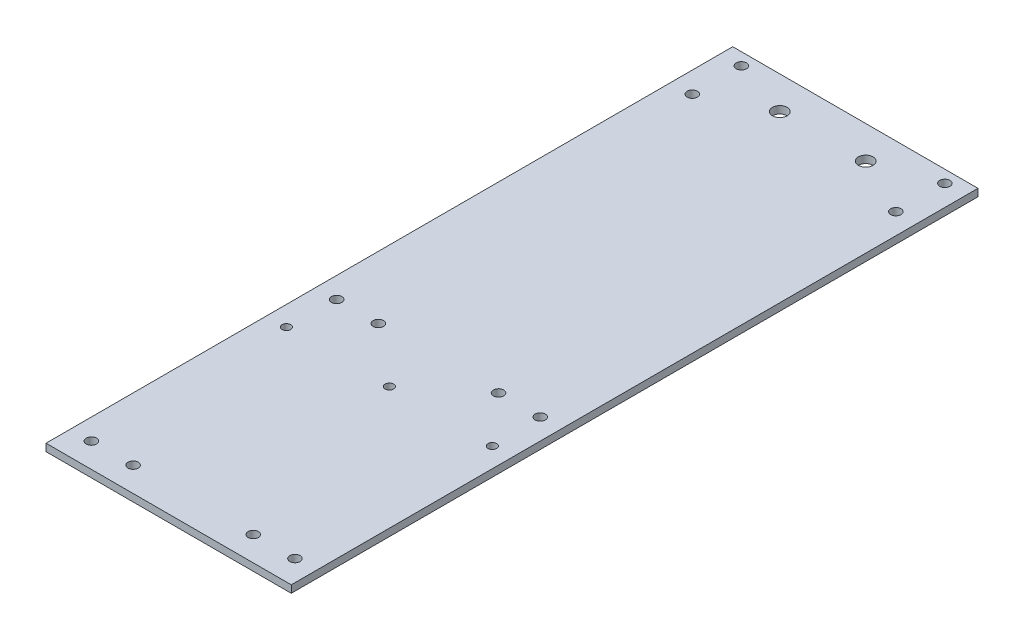
ISO-10303-21;
HEADER;
FILE_DESCRIPTION(('STEP AP214'),'2;1');
FILE_NAME('part.step','',(''),(''),'','','');
FILE_SCHEMA(('AUTOMOTIVE_DESIGN { 1 0 10303 214 1 1 1 1 }'));
ENDSEC;
DATA;
#1=APPLICATION_CONTEXT('core data for automotive mechanical design processes');
#2=APPLICATION_PROTOCOL_DEFINITION('international standard','automotive_design',2000,#1);
#3=PRODUCT_CONTEXT('',#1,'mechanical');
#4=PRODUCT('Part','Part','',(#3));
#5=PRODUCT_RELATED_PRODUCT_CATEGORY('part','',(#4));
#6=PRODUCT_DEFINITION_FORMATION('','',#4);
#7=PRODUCT_DEFINITION_CONTEXT('part definition',#1,'design');
#8=PRODUCT_DEFINITION('design','',#6,#7);
#9=PRODUCT_DEFINITION_SHAPE('','',#8);
#10=(LENGTH_UNIT() NAMED_UNIT(*) SI_UNIT(.MILLI.,.METRE.));
#11=(NAMED_UNIT(*) PLANE_ANGLE_UNIT() SI_UNIT($,.RADIAN.));
#12=(NAMED_UNIT(*) SI_UNIT($,.STERADIAN.) SOLID_ANGLE_UNIT());
#13=UNCERTAINTY_MEASURE_WITH_UNIT(LENGTH_MEASURE(1.E-05),#10,'distance_accuracy_value','');
#14=(GEOMETRIC_REPRESENTATION_CONTEXT(3) GLOBAL_UNCERTAINTY_ASSIGNED_CONTEXT((#13)) GLOBAL_UNIT_ASSIGNED_CONTEXT((#10,
#11,#12)) REPRESENTATION_CONTEXT('',''));
#15=CARTESIAN_POINT('',(0.,0.,0.));
#16=DIRECTION('',(0.,0.,1.));
#17=DIRECTION('',(1.,0.,0.));
#18=AXIS2_PLACEMENT_3D('',#15,#16,#17);
#19=CARTESIAN_POINT('',(0.,3.,0.));
#20=DIRECTION('',(0.,1.,0.));
#21=DIRECTION('',(0.,0.,1.));
#22=AXIS2_PLACEMENT_3D('',#19,#20,#21);
#23=PLANE('',#22);
#24=CARTESIAN_POINT('',(41.4999999999999,3.,-215.));
#25=DIRECTION('',(0.,1.,0.));
#26=DIRECTION('',(0.,0.,1.));
#27=AXIS2_PLACEMENT_3D('',#24,#25,#26);
#28=CIRCLE('',#27,2.09999999999999);
#29=CARTESIAN_POINT('',(41.4999999999999,3.,-212.9));
#30=VERTEX_POINT('',#29);
#31=EDGE_CURVE('E282',#30,#30,#28,.T.);
#32=ORIENTED_EDGE('',*,*,#31,.F.);
#33=EDGE_LOOP('',(#32));
#34=FACE_BOUND('',#33,.T.);
#35=CARTESIAN_POINT('',(41.4999999999999,3.,-195.));
#36=DIRECTION('',(0.,1.,0.));
#37=DIRECTION('',(0.,0.,1.));
#38=AXIS2_PLACEMENT_3D('',#35,#36,#37);
#39=CIRCLE('',#38,2.09999999999999);
#40=CARTESIAN_POINT('',(41.4999999999999,3.,-192.9));
#41=VERTEX_POINT('',#40);
#42=EDGE_CURVE('E292',#41,#41,#39,.T.);
#43=ORIENTED_EDGE('',*,*,#42,.F.);
#44=EDGE_LOOP('',(#43));
#45=FACE_BOUND('',#44,.T.);
#46=CARTESIAN_POINT('',(-41.5000000000001,3.,-195.));
#47=DIRECTION('',(0.,1.,0.));
#48=DIRECTION('',(0.,0.,1.));
#49=AXIS2_PLACEMENT_3D('',#46,#47,#48);
#50=CIRCLE('',#49,2.09999999999999);
#51=CARTESIAN_POINT('',(-41.5000000000001,3.,-192.9));
#52=VERTEX_POINT('',#51);
#53=EDGE_CURVE('E298',#52,#52,#50,.T.);
#54=ORIENTED_EDGE('',*,*,#53,.F.);
#55=EDGE_LOOP('',(#54));
#56=FACE_BOUND('',#55,.T.);
#57=CARTESIAN_POINT('',(-41.5000000000001,3.,-215.));
#58=DIRECTION('',(0.,1.,0.));
#59=DIRECTION('',(0.,0.,1.));
#60=AXIS2_PLACEMENT_3D('',#57,#58,#59);
#61=CIRCLE('',#60,2.09999999999999);
#62=CARTESIAN_POINT('',(-41.5000000000001,3.,-212.9));
#63=VERTEX_POINT('',#62);
#64=EDGE_CURVE('E304',#63,#63,#61,.T.);
#65=ORIENTED_EDGE('',*,*,#64,.F.);
#66=EDGE_LOOP('',(#65));
#67=FACE_BOUND('',#66,.T.);
#68=CARTESIAN_POINT('',(-17.5,3.,-206.7));
#69=DIRECTION('',(0.,1.,0.));
#70=DIRECTION('',(0.,0.,1.));
#71=AXIS2_PLACEMENT_3D('',#68,#69,#70);
#72=CIRCLE('',#71,3.);
#73=CARTESIAN_POINT('',(-17.5,3.,-203.7));
#74=VERTEX_POINT('',#73);
#75=EDGE_CURVE('E310',#74,#74,#72,.T.);
#76=ORIENTED_EDGE('',*,*,#75,.F.);
#77=EDGE_LOOP('',(#76));
#78=FACE_BOUND('',#77,.T.);
#79=CARTESIAN_POINT('',(17.5,3.,-206.7));
#80=DIRECTION('',(0.,1.,0.));
#81=DIRECTION('',(0.,0.,1.));
#82=AXIS2_PLACEMENT_3D('',#79,#80,#81);
#83=CIRCLE('',#82,3.);
#84=CARTESIAN_POINT('',(17.5,3.,-203.7));
#85=VERTEX_POINT('',#84);
#86=EDGE_CURVE('E105',#85,#85,#83,.T.);
#87=ORIENTED_EDGE('',*,*,#86,.F.);
#88=EDGE_LOOP('',(#87));
#89=FACE_BOUND('',#88,.T.);
#90=CARTESIAN_POINT('',(-24.5,3.,50.));
#91=DIRECTION('',(0.,1.,0.));
#92=DIRECTION('',(0.,0.,1.));
#93=AXIS2_PLACEMENT_3D('',#90,#91,#92);
#94=CIRCLE('',#93,2.1);
#95=CARTESIAN_POINT('',(-24.5,3.,52.1));
#96=VERTEX_POINT('',#95);
#97=EDGE_CURVE('E117',#96,#96,#94,.T.);
#98=ORIENTED_EDGE('',*,*,#97,.F.);
#99=EDGE_LOOP('',(#98));
#100=FACE_BOUND('',#99,.T.);
#101=CARTESIAN_POINT('',(24.5,3.,50.));
#102=DIRECTION('',(0.,1.,0.));
#103=DIRECTION('',(0.,0.,1.));
#104=AXIS2_PLACEMENT_3D('',#101,#102,#103);
#105=CIRCLE('',#104,2.1);
#106=CARTESIAN_POINT('',(24.5,3.,52.1));
#107=VERTEX_POINT('',#106);
#108=EDGE_CURVE('E123',#107,#107,#105,.T.);
#109=ORIENTED_EDGE('',*,*,#108,.F.);
#110=EDGE_LOOP('',(#109));
#111=FACE_BOUND('',#110,.T.);
#112=CARTESIAN_POINT('',(24.5,3.,-50.));
#113=DIRECTION('',(0.,1.,0.));
#114=DIRECTION('',(0.,0.,1.));
#115=AXIS2_PLACEMENT_3D('',#112,#113,#114);
#116=CIRCLE('',#115,2.1);
#117=CARTESIAN_POINT('',(24.5,3.,-47.9));
#118=VERTEX_POINT('',#117);
#119=EDGE_CURVE('E129',#118,#118,#116,.T.);
#120=ORIENTED_EDGE('',*,*,#119,.F.);
#121=EDGE_LOOP('',(#120));
#122=FACE_BOUND('',#121,.T.);
#123=CARTESIAN_POINT('',(-24.5,3.,-50.));
#124=DIRECTION('',(0.,1.,0.));
#125=DIRECTION('',(0.,0.,1.));
#126=AXIS2_PLACEMENT_3D('',#123,#124,#125);
#127=CIRCLE('',#126,2.1);
#128=CARTESIAN_POINT('',(-24.5,3.,-47.9));
#129=VERTEX_POINT('',#128);
#130=EDGE_CURVE('E135',#129,#129,#127,.T.);
#131=ORIENTED_EDGE('',*,*,#130,.F.);
#132=EDGE_LOOP('',(#131));
#133=FACE_BOUND('',#132,.T.);
#134=CARTESIAN_POINT('',(0.,3.,-30.));
#135=DIRECTION('',(0.,1.,0.));
#136=DIRECTION('',(0.,0.,1.));
#137=AXIS2_PLACEMENT_3D('',#134,#135,#136);
#138=CIRCLE('',#137,1.75);
#139=CARTESIAN_POINT('',(0.,3.,-28.25));
#140=VERTEX_POINT('',#139);
#141=EDGE_CURVE('E145',#140,#140,#138,.T.);
#142=ORIENTED_EDGE('',*,*,#141,.F.);
#143=EDGE_LOOP('',(#142));
#144=FACE_BOUND('',#143,.T.);
#145=CARTESIAN_POINT('',(-41.5,3.,-50.));
#146=DIRECTION('',(0.,1.,0.));
#147=DIRECTION('',(0.,0.,-1.));
#148=AXIS2_PLACEMENT_3D('',#145,#146,#147);
#149=CIRCLE('',#148,2.1);
#150=CARTESIAN_POINT('',(-41.5,3.,-52.1));
#151=VERTEX_POINT('',#150);
#152=EDGE_CURVE('E157',#151,#151,#149,.T.);
#153=ORIENTED_EDGE('',*,*,#152,.F.);
#154=EDGE_LOOP('',(#153));
#155=FACE_BOUND('',#154,.T.);
#156=CARTESIAN_POINT('',(41.5,3.,50.));
#157=DIRECTION('',(0.,1.,0.));
#158=DIRECTION('',(0.,0.,-1.));
#159=AXIS2_PLACEMENT_3D('',#156,#157,#158);
#160=CIRCLE('',#159,2.09999999999999);
#161=CARTESIAN_POINT('',(41.5,3.,47.9));
#162=VERTEX_POINT('',#161);
#163=EDGE_CURVE('E169',#162,#162,#160,.T.);
#164=ORIENTED_EDGE('',*,*,#163,.F.);
#165=EDGE_LOOP('',(#164));
#166=FACE_BOUND('',#165,.T.);
#167=DIRECTION('',(0.,0.,-1.));
#168=VECTOR('',#167,1.);
#169=CARTESIAN_POINT('',(50.,3.,-60.));
#170=LINE('',#169,#168);
#171=CARTESIAN_POINT('',(50.,3.,60.));
#172=VERTEX_POINT('',#171);
#173=CARTESIAN_POINT('',(50.,3.,-220.));
#174=VERTEX_POINT('',#173);
#175=EDGE_CURVE('E92',#172,#174,#170,.T.);
#176=ORIENTED_EDGE('',*,*,#175,.T.);
#177=DIRECTION('',(1.,0.,0.));
#178=VECTOR('',#177,1.);
#179=CARTESIAN_POINT('',(-50.,3.,-220.));
#180=LINE('',#179,#178);
#181=CARTESIAN_POINT('',(-50.,3.,-220.));
#182=VERTEX_POINT('',#181);
#183=EDGE_CURVE('E95',#182,#174,#180,.T.);
#184=ORIENTED_EDGE('',*,*,#183,.F.);
#185=DIRECTION('',(0.,0.,1.));
#186=VECTOR('',#185,1.);
#187=CARTESIAN_POINT('',(-50.,3.,-60.));
#188=LINE('',#187,#186);
#189=CARTESIAN_POINT('',(-50.,3.,60.));
#190=VERTEX_POINT('',#189);
#191=EDGE_CURVE('E87',#182,#190,#188,.T.);
#192=ORIENTED_EDGE('',*,*,#191,.T.);
#193=DIRECTION('',(1.,0.,0.));
#194=VECTOR('',#193,1.);
#195=CARTESIAN_POINT('',(-50.,3.,60.));
#196=LINE('',#195,#194);
#197=EDGE_CURVE('E62',#190,#172,#196,.T.);
#198=ORIENTED_EDGE('',*,*,#197,.T.);
#199=EDGE_LOOP('',(#176,#184,#192,#198));
#200=FACE_BOUND('',#199,.T.);
#201=CARTESIAN_POINT('',(41.5,3.,-50.));
#202=DIRECTION('',(0.,1.,0.));
#203=DIRECTION('',(0.,0.,1.));
#204=AXIS2_PLACEMENT_3D('',#201,#202,#203);
#205=CIRCLE('',#204,2.1);
#206=CARTESIAN_POINT('',(41.5,3.,-47.9));
#207=VERTEX_POINT('',#206);
#208=EDGE_CURVE('E175',#207,#207,#205,.T.);
#209=ORIENTED_EDGE('',*,*,#208,.F.);
#210=EDGE_LOOP('',(#209));
#211=FACE_BOUND('',#210,.T.);
#212=CARTESIAN_POINT('',(-41.5,3.,50.));
#213=DIRECTION('',(0.,1.,0.));
#214=DIRECTION('',(0.,0.,1.));
#215=AXIS2_PLACEMENT_3D('',#212,#213,#214);
#216=CIRCLE('',#215,2.09999999999999);
#217=CARTESIAN_POINT('',(-41.5,3.,52.1));
#218=VERTEX_POINT('',#217);
#219=EDGE_CURVE('E163',#218,#218,#216,.T.);
#220=ORIENTED_EDGE('',*,*,#219,.F.);
#221=EDGE_LOOP('',(#220));
#222=FACE_BOUND('',#221,.T.);
#223=CARTESIAN_POINT('',(-42.,3.,-30.));
#224=DIRECTION('',(0.,1.,0.));
#225=DIRECTION('',(0.,0.,1.));
#226=AXIS2_PLACEMENT_3D('',#223,#224,#225);
#227=CIRCLE('',#226,1.75);
#228=CARTESIAN_POINT('',(-42.,3.,-28.25));
#229=VERTEX_POINT('',#228);
#230=EDGE_CURVE('E151',#229,#229,#227,.T.);
#231=ORIENTED_EDGE('',*,*,#230,.F.);
#232=EDGE_LOOP('',(#231));
#233=FACE_BOUND('',#232,.T.);
#234=CARTESIAN_POINT('',(42.,3.,-30.));
#235=DIRECTION('',(0.,1.,0.));
#236=DIRECTION('',(0.,0.,1.));
#237=AXIS2_PLACEMENT_3D('',#234,#235,#236);
#238=CIRCLE('',#237,1.75);
#239=CARTESIAN_POINT('',(42.,3.,-28.25));
#240=VERTEX_POINT('',#239);
#241=EDGE_CURVE('E139',#240,#240,#238,.T.);
#242=ORIENTED_EDGE('',*,*,#241,.F.);
#243=EDGE_LOOP('',(#242));
#244=FACE_BOUND('',#243,.T.);
#245=ADVANCED_FACE('F45',(#34,#45,#56,#67,#78,#89,#100,#111,#122,#133,#144,#155,#166,#200,#211,
#222,#233,#244),#23,.T.);
#246=CARTESIAN_POINT('',(0.,0.,0.));
#247=DIRECTION('',(0.,1.,0.));
#248=DIRECTION('',(0.,0.,1.));
#249=AXIS2_PLACEMENT_3D('',#246,#247,#248);
#250=PLANE('',#249);
#251=CARTESIAN_POINT('',(41.4999999999999,0.,-215.));
#252=DIRECTION('',(0.,-1.,0.));
#253=DIRECTION('',(0.,0.,-1.));
#254=AXIS2_PLACEMENT_3D('',#251,#252,#253);
#255=CIRCLE('',#254,2.09999999999999);
#256=CARTESIAN_POINT('',(41.4999999999999,0.,-217.1));
#257=VERTEX_POINT('',#256);
#258=EDGE_CURVE('E285',#257,#257,#255,.T.);
#259=ORIENTED_EDGE('',*,*,#258,.F.);
#260=EDGE_LOOP('',(#259));
#261=FACE_BOUND('',#260,.T.);
#262=CARTESIAN_POINT('',(41.4999999999999,0.,-195.));
#263=DIRECTION('',(0.,-1.,0.));
#264=DIRECTION('',(0.,0.,-1.));
#265=AXIS2_PLACEMENT_3D('',#262,#263,#264);
#266=CIRCLE('',#265,2.09999999999999);
#267=CARTESIAN_POINT('',(41.4999999999999,0.,-197.1));
#268=VERTEX_POINT('',#267);
#269=EDGE_CURVE('E287',#268,#268,#266,.T.);
#270=ORIENTED_EDGE('',*,*,#269,.F.);
#271=EDGE_LOOP('',(#270));
#272=FACE_BOUND('',#271,.T.);
#273=CARTESIAN_POINT('',(-41.5000000000001,0.,-195.));
#274=DIRECTION('',(0.,-1.,0.));
#275=DIRECTION('',(0.,0.,-1.));
#276=AXIS2_PLACEMENT_3D('',#273,#274,#275);
#277=CIRCLE('',#276,2.09999999999999);
#278=CARTESIAN_POINT('',(-41.5000000000001,0.,-197.1));
#279=VERTEX_POINT('',#278);
#280=EDGE_CURVE('E295',#279,#279,#277,.T.);
#281=ORIENTED_EDGE('',*,*,#280,.F.);
#282=EDGE_LOOP('',(#281));
#283=FACE_BOUND('',#282,.T.);
#284=CARTESIAN_POINT('',(-41.5000000000001,0.,-215.));
#285=DIRECTION('',(0.,-1.,0.));
#286=DIRECTION('',(0.,0.,-1.));
#287=AXIS2_PLACEMENT_3D('',#284,#285,#286);
#288=CIRCLE('',#287,2.09999999999999);
#289=CARTESIAN_POINT('',(-41.5000000000001,0.,-217.1));
#290=VERTEX_POINT('',#289);
#291=EDGE_CURVE('E301',#290,#290,#288,.T.);
#292=ORIENTED_EDGE('',*,*,#291,.F.);
#293=EDGE_LOOP('',(#292));
#294=FACE_BOUND('',#293,.T.);
#295=CARTESIAN_POINT('',(-17.5,0.,-206.7));
#296=DIRECTION('',(0.,-1.,0.));
#297=DIRECTION('',(0.,0.,-1.));
#298=AXIS2_PLACEMENT_3D('',#295,#296,#297);
#299=CIRCLE('',#298,3.);
#300=CARTESIAN_POINT('',(-17.5,0.,-209.7));
#301=VERTEX_POINT('',#300);
#302=EDGE_CURVE('E307',#301,#301,#299,.T.);
#303=ORIENTED_EDGE('',*,*,#302,.F.);
#304=EDGE_LOOP('',(#303));
#305=FACE_BOUND('',#304,.T.);
#306=CARTESIAN_POINT('',(17.5,0.,-206.7));
#307=DIRECTION('',(0.,-1.,0.));
#308=DIRECTION('',(0.,0.,-1.));
#309=AXIS2_PLACEMENT_3D('',#306,#307,#308);
#310=CIRCLE('',#309,3.);
#311=CARTESIAN_POINT('',(17.5,0.,-209.7));
#312=VERTEX_POINT('',#311);
#313=EDGE_CURVE('E108',#312,#312,#310,.T.);
#314=ORIENTED_EDGE('',*,*,#313,.F.);
#315=EDGE_LOOP('',(#314));
#316=FACE_BOUND('',#315,.T.);
#317=CARTESIAN_POINT('',(-24.5,0.,50.));
#318=DIRECTION('',(0.,-1.,0.));
#319=DIRECTION('',(0.,0.,-1.));
#320=AXIS2_PLACEMENT_3D('',#317,#318,#319);
#321=CIRCLE('',#320,2.1);
#322=CARTESIAN_POINT('',(-24.5,0.,47.9));
#323=VERTEX_POINT('',#322);
#324=EDGE_CURVE('E114',#323,#323,#321,.T.);
#325=ORIENTED_EDGE('',*,*,#324,.F.);
#326=EDGE_LOOP('',(#325));
#327=FACE_BOUND('',#326,.T.);
#328=CARTESIAN_POINT('',(24.5,0.,50.));
#329=DIRECTION('',(0.,-1.,0.));
#330=DIRECTION('',(0.,0.,-1.));
#331=AXIS2_PLACEMENT_3D('',#328,#329,#330);
#332=CIRCLE('',#331,2.1);
#333=CARTESIAN_POINT('',(24.5,0.,47.9));
#334=VERTEX_POINT('',#333);
#335=EDGE_CURVE('E120',#334,#334,#332,.T.);
#336=ORIENTED_EDGE('',*,*,#335,.F.);
#337=EDGE_LOOP('',(#336));
#338=FACE_BOUND('',#337,.T.);
#339=CARTESIAN_POINT('',(24.5,0.,-50.));
#340=DIRECTION('',(0.,-1.,0.));
#341=DIRECTION('',(0.,0.,-1.));
#342=AXIS2_PLACEMENT_3D('',#339,#340,#341);
#343=CIRCLE('',#342,2.1);
#344=CARTESIAN_POINT('',(24.5,0.,-52.1));
#345=VERTEX_POINT('',#344);
#346=EDGE_CURVE('E126',#345,#345,#343,.T.);
#347=ORIENTED_EDGE('',*,*,#346,.F.);
#348=EDGE_LOOP('',(#347));
#349=FACE_BOUND('',#348,.T.);
#350=CARTESIAN_POINT('',(-24.5,0.,-50.));
#351=DIRECTION('',(0.,-1.,0.));
#352=DIRECTION('',(0.,0.,-1.));
#353=AXIS2_PLACEMENT_3D('',#350,#351,#352);
#354=CIRCLE('',#353,2.1);
#355=CARTESIAN_POINT('',(-24.5,0.,-52.1));
#356=VERTEX_POINT('',#355);
#357=EDGE_CURVE('E132',#356,#356,#354,.T.);
#358=ORIENTED_EDGE('',*,*,#357,.F.);
#359=EDGE_LOOP('',(#358));
#360=FACE_BOUND('',#359,.T.);
#361=DIRECTION('',(0.,0.,-1.));
#362=VECTOR('',#361,1.);
#363=CARTESIAN_POINT('',(50.,0.,-60.));
#364=LINE('',#363,#362);
#365=CARTESIAN_POINT('',(50.,0.,60.));
#366=VERTEX_POINT('',#365);
#367=CARTESIAN_POINT('',(50.,0.,-220.));
#368=VERTEX_POINT('',#367);
#369=EDGE_CURVE('E178',#366,#368,#364,.T.);
#370=ORIENTED_EDGE('',*,*,#369,.F.);
#371=DIRECTION('',(1.,0.,0.));
#372=VECTOR('',#371,1.);
#373=CARTESIAN_POINT('',(-50.,0.,60.));
#374=LINE('',#373,#372);
#375=CARTESIAN_POINT('',(-50.,0.,60.));
#376=VERTEX_POINT('',#375);
#377=EDGE_CURVE('E181',#376,#366,#374,.T.);
#378=ORIENTED_EDGE('',*,*,#377,.F.);
#379=DIRECTION('',(0.,0.,1.));
#380=VECTOR('',#379,1.);
#381=CARTESIAN_POINT('',(-50.,0.,-60.));
#382=LINE('',#381,#380);
#383=CARTESIAN_POINT('',(-50.,0.,-220.));
#384=VERTEX_POINT('',#383);
#385=EDGE_CURVE('E73',#384,#376,#382,.T.);
#386=ORIENTED_EDGE('',*,*,#385,.F.);
#387=DIRECTION('',(-1.,0.,0.));
#388=VECTOR('',#387,1.);
#389=CARTESIAN_POINT('',(-50.,0.,-220.));
#390=LINE('',#389,#388);
#391=EDGE_CURVE('E104',#368,#384,#390,.T.);
#392=ORIENTED_EDGE('',*,*,#391,.F.);
#393=EDGE_LOOP('',(#370,#378,#386,#392));
#394=FACE_BOUND('',#393,.T.);
#395=CARTESIAN_POINT('',(41.5,0.,-50.));
#396=DIRECTION('',(0.,1.,0.));
#397=DIRECTION('',(0.,0.,1.));
#398=AXIS2_PLACEMENT_3D('',#395,#396,#397);
#399=CIRCLE('',#398,2.1);
#400=CARTESIAN_POINT('',(41.5,0.,-47.9));
#401=VERTEX_POINT('',#400);
#402=EDGE_CURVE('E172',#401,#401,#399,.T.);
#403=ORIENTED_EDGE('',*,*,#402,.T.);
#404=EDGE_LOOP('',(#403));
#405=FACE_BOUND('',#404,.T.);
#406=CARTESIAN_POINT('',(41.5,0.,50.));
#407=DIRECTION('',(0.,1.,0.));
#408=DIRECTION('',(0.,0.,-1.));
#409=AXIS2_PLACEMENT_3D('',#406,#407,#408);
#410=CIRCLE('',#409,2.09999999999999);
#411=CARTESIAN_POINT('',(41.5,0.,47.9));
#412=VERTEX_POINT('',#411);
#413=EDGE_CURVE('E166',#412,#412,#410,.T.);
#414=ORIENTED_EDGE('',*,*,#413,.T.);
#415=EDGE_LOOP('',(#414));
#416=FACE_BOUND('',#415,.T.);
#417=CARTESIAN_POINT('',(-41.5,0.,50.));
#418=DIRECTION('',(0.,1.,0.));
#419=DIRECTION('',(0.,0.,1.));
#420=AXIS2_PLACEMENT_3D('',#417,#418,#419);
#421=CIRCLE('',#420,2.09999999999999);
#422=CARTESIAN_POINT('',(-41.5,0.,52.1));
#423=VERTEX_POINT('',#422);
#424=EDGE_CURVE('E160',#423,#423,#421,.T.);
#425=ORIENTED_EDGE('',*,*,#424,.T.);
#426=EDGE_LOOP('',(#425));
#427=FACE_BOUND('',#426,.T.);
#428=CARTESIAN_POINT('',(-41.5,0.,-50.));
#429=DIRECTION('',(0.,1.,0.));
#430=DIRECTION('',(0.,0.,-1.));
#431=AXIS2_PLACEMENT_3D('',#428,#429,#430);
#432=CIRCLE('',#431,2.1);
#433=CARTESIAN_POINT('',(-41.5,0.,-52.1));
#434=VERTEX_POINT('',#433);
#435=EDGE_CURVE('E154',#434,#434,#432,.T.);
#436=ORIENTED_EDGE('',*,*,#435,.T.);
#437=EDGE_LOOP('',(#436));
#438=FACE_BOUND('',#437,.T.);
#439=CARTESIAN_POINT('',(-42.,0.,-30.));
#440=DIRECTION('',(0.,1.,0.));
#441=DIRECTION('',(0.,0.,1.));
#442=AXIS2_PLACEMENT_3D('',#439,#440,#441);
#443=CIRCLE('',#442,1.75);
#444=CARTESIAN_POINT('',(-42.,0.,-28.25));
#445=VERTEX_POINT('',#444);
#446=EDGE_CURVE('E148',#445,#445,#443,.T.);
#447=ORIENTED_EDGE('',*,*,#446,.T.);
#448=EDGE_LOOP('',(#447));
#449=FACE_BOUND('',#448,.T.);
#450=CARTESIAN_POINT('',(0.,0.,-30.));
#451=DIRECTION('',(0.,1.,0.));
#452=DIRECTION('',(0.,0.,1.));
#453=AXIS2_PLACEMENT_3D('',#450,#451,#452);
#454=CIRCLE('',#453,1.75);
#455=CARTESIAN_POINT('',(0.,0.,-28.25));
#456=VERTEX_POINT('',#455);
#457=EDGE_CURVE('E142',#456,#456,#454,.T.);
#458=ORIENTED_EDGE('',*,*,#457,.T.);
#459=EDGE_LOOP('',(#458));
#460=FACE_BOUND('',#459,.T.);
#461=CARTESIAN_POINT('',(42.,0.,-30.));
#462=DIRECTION('',(0.,1.,0.));
#463=DIRECTION('',(0.,0.,1.));
#464=AXIS2_PLACEMENT_3D('',#461,#462,#463);
#465=CIRCLE('',#464,1.75);
#466=CARTESIAN_POINT('',(42.,0.,-28.25));
#467=VERTEX_POINT('',#466);
#468=EDGE_CURVE('E138',#467,#467,#465,.T.);
#469=ORIENTED_EDGE('',*,*,#468,.T.);
#470=EDGE_LOOP('',(#469));
#471=FACE_BOUND('',#470,.T.);
#472=ADVANCED_FACE('F190',(#261,#272,#283,#294,#305,#316,#327,#338,#349,#360,#394,#405,#416,
#427,#438,#449,#460,#471),#250,.F.);
#473=CARTESIAN_POINT('',(50.,3.,-60.));
#474=DIRECTION('',(-1.,0.,0.));
#475=DIRECTION('',(0.,0.,1.));
#476=AXIS2_PLACEMENT_3D('',#473,#474,#475);
#477=PLANE('',#476);
#478=ORIENTED_EDGE('',*,*,#369,.T.);
#479=DIRECTION('',(0.,-1.,0.));
#480=VECTOR('',#479,1.);
#481=CARTESIAN_POINT('',(50.,0.,-220.));
#482=LINE('',#481,#480);
#483=EDGE_CURVE('E101',#174,#368,#482,.T.);
#484=ORIENTED_EDGE('',*,*,#483,.F.);
#485=ORIENTED_EDGE('',*,*,#175,.F.);
#486=DIRECTION('',(0.,-1.,0.));
#487=VECTOR('',#486,1.);
#488=CARTESIAN_POINT('',(50.,3.,60.));
#489=LINE('',#488,#487);
#490=EDGE_CURVE('E54',#172,#366,#489,.T.);
#491=ORIENTED_EDGE('',*,*,#490,.T.);
#492=EDGE_LOOP('',(#478,#484,#485,#491));
#493=FACE_BOUND('',#492,.T.);
#494=ADVANCED_FACE('F47',(#493),#477,.F.);
#495=CARTESIAN_POINT('',(-50.,3.,-60.));
#496=DIRECTION('',(1.,0.,0.));
#497=DIRECTION('',(0.,0.,-1.));
#498=AXIS2_PLACEMENT_3D('',#495,#496,#497);
#499=PLANE('',#498);
#500=ORIENTED_EDGE('',*,*,#385,.T.);
#501=DIRECTION('',(0.,-1.,0.));
#502=VECTOR('',#501,1.);
#503=CARTESIAN_POINT('',(-50.,3.,60.));
#504=LINE('',#503,#502);
#505=EDGE_CURVE('E13',#190,#376,#504,.T.);
#506=ORIENTED_EDGE('',*,*,#505,.F.);
#507=ORIENTED_EDGE('',*,*,#191,.F.);
#508=DIRECTION('',(0.,1.,0.));
#509=VECTOR('',#508,1.);
#510=CARTESIAN_POINT('',(-50.,0.,-220.));
#511=LINE('',#510,#509);
#512=EDGE_CURVE('E91',#384,#182,#511,.T.);
#513=ORIENTED_EDGE('',*,*,#512,.F.);
#514=EDGE_LOOP('',(#500,#506,#507,#513));
#515=FACE_BOUND('',#514,.T.);
#516=ADVANCED_FACE('F89',(#515),#499,.F.);
#517=CARTESIAN_POINT('',(-50.,3.,60.));
#518=DIRECTION('',(0.,0.,-1.));
#519=DIRECTION('',(-1.,0.,0.));
#520=AXIS2_PLACEMENT_3D('',#517,#518,#519);
#521=PLANE('',#520);
#522=ORIENTED_EDGE('',*,*,#377,.T.);
#523=ORIENTED_EDGE('',*,*,#490,.F.);
#524=ORIENTED_EDGE('',*,*,#197,.F.);
#525=ORIENTED_EDGE('',*,*,#505,.T.);
#526=EDGE_LOOP('',(#522,#523,#524,#525));
#527=FACE_BOUND('',#526,.T.);
#528=ADVANCED_FACE('F192',(#527),#521,.F.);
#529=CARTESIAN_POINT('',(41.5,3.,-50.));
#530=DIRECTION('',(0.,-1.,0.));
#531=DIRECTION('',(0.,0.,-1.));
#532=AXIS2_PLACEMENT_3D('',#529,#530,#531);
#533=CYLINDRICAL_SURFACE('',#532,2.1);
#534=ORIENTED_EDGE('',*,*,#208,.T.);
#535=EDGE_LOOP('',(#534));
#536=FACE_BOUND('',#535,.T.);
#537=ORIENTED_EDGE('',*,*,#402,.F.);
#538=EDGE_LOOP('',(#537));
#539=FACE_BOUND('',#538,.T.);
#540=ADVANCED_FACE('F194',(#536,#539),#533,.F.);
#541=CARTESIAN_POINT('',(41.5,3.,50.));
#542=DIRECTION('',(0.,-1.,0.));
#543=DIRECTION('',(0.,0.,-1.));
#544=AXIS2_PLACEMENT_3D('',#541,#542,#543);
#545=CYLINDRICAL_SURFACE('',#544,2.09999999999999);
#546=ORIENTED_EDGE('',*,*,#163,.T.);
#547=EDGE_LOOP('',(#546));
#548=FACE_BOUND('',#547,.T.);
#549=ORIENTED_EDGE('',*,*,#413,.F.);
#550=EDGE_LOOP('',(#549));
#551=FACE_BOUND('',#550,.T.);
#552=ADVANCED_FACE('F199',(#548,#551),#545,.F.);
#553=CARTESIAN_POINT('',(-41.5,3.,50.));
#554=DIRECTION('',(0.,-1.,0.));
#555=DIRECTION('',(0.,0.,-1.));
#556=AXIS2_PLACEMENT_3D('',#553,#554,#555);
#557=CYLINDRICAL_SURFACE('',#556,2.09999999999999);
#558=ORIENTED_EDGE('',*,*,#219,.T.);
#559=EDGE_LOOP('',(#558));
#560=FACE_BOUND('',#559,.T.);
#561=ORIENTED_EDGE('',*,*,#424,.F.);
#562=EDGE_LOOP('',(#561));
#563=FACE_BOUND('',#562,.T.);
#564=ADVANCED_FACE('F217',(#560,#563),#557,.F.);
#565=CARTESIAN_POINT('',(-41.5,3.,-50.));
#566=DIRECTION('',(0.,-1.,0.));
#567=DIRECTION('',(0.,0.,-1.));
#568=AXIS2_PLACEMENT_3D('',#565,#566,#567);
#569=CYLINDRICAL_SURFACE('',#568,2.1);
#570=ORIENTED_EDGE('',*,*,#152,.T.);
#571=EDGE_LOOP('',(#570));
#572=FACE_BOUND('',#571,.T.);
#573=ORIENTED_EDGE('',*,*,#435,.F.);
#574=EDGE_LOOP('',(#573));
#575=FACE_BOUND('',#574,.T.);
#576=ADVANCED_FACE('F221',(#572,#575),#569,.F.);
#577=CARTESIAN_POINT('',(-42.,3.,-30.));
#578=DIRECTION('',(0.,-1.,0.));
#579=DIRECTION('',(0.,0.,-1.));
#580=AXIS2_PLACEMENT_3D('',#577,#578,#579);
#581=CYLINDRICAL_SURFACE('',#580,1.75);
#582=ORIENTED_EDGE('',*,*,#230,.T.);
#583=EDGE_LOOP('',(#582));
#584=FACE_BOUND('',#583,.T.);
#585=ORIENTED_EDGE('',*,*,#446,.F.);
#586=EDGE_LOOP('',(#585));
#587=FACE_BOUND('',#586,.T.);
#588=ADVANCED_FACE('F225',(#584,#587),#581,.F.);
#589=CARTESIAN_POINT('',(0.,3.,-30.));
#590=DIRECTION('',(0.,-1.,0.));
#591=DIRECTION('',(0.,0.,-1.));
#592=AXIS2_PLACEMENT_3D('',#589,#590,#591);
#593=CYLINDRICAL_SURFACE('',#592,1.75);
#594=ORIENTED_EDGE('',*,*,#141,.T.);
#595=EDGE_LOOP('',(#594));
#596=FACE_BOUND('',#595,.T.);
#597=ORIENTED_EDGE('',*,*,#457,.F.);
#598=EDGE_LOOP('',(#597));
#599=FACE_BOUND('',#598,.T.);
#600=ADVANCED_FACE('F229',(#596,#599),#593,.F.);
#601=CARTESIAN_POINT('',(42.,3.,-30.));
#602=DIRECTION('',(0.,-1.,0.));
#603=DIRECTION('',(0.,0.,-1.));
#604=AXIS2_PLACEMENT_3D('',#601,#602,#603);
#605=CYLINDRICAL_SURFACE('',#604,1.75);
#606=ORIENTED_EDGE('',*,*,#241,.T.);
#607=EDGE_LOOP('',(#606));
#608=FACE_BOUND('',#607,.T.);
#609=ORIENTED_EDGE('',*,*,#468,.F.);
#610=EDGE_LOOP('',(#609));
#611=FACE_BOUND('',#610,.T.);
#612=ADVANCED_FACE('F233',(#608,#611),#605,.F.);
#613=CARTESIAN_POINT('',(-24.5,10.,-50.));
#614=DIRECTION('',(0.,-1.,0.));
#615=DIRECTION('',(0.,0.,-1.));
#616=AXIS2_PLACEMENT_3D('',#613,#614,#615);
#617=CYLINDRICAL_SURFACE('',#616,2.1);
#618=ORIENTED_EDGE('',*,*,#130,.T.);
#619=EDGE_LOOP('',(#618));
#620=FACE_BOUND('',#619,.T.);
#621=ORIENTED_EDGE('',*,*,#357,.T.);
#622=EDGE_LOOP('',(#621));
#623=FACE_BOUND('',#622,.T.);
#624=ADVANCED_FACE('F237',(#620,#623),#617,.F.);
#625=CARTESIAN_POINT('',(24.5,10.,-50.));
#626=DIRECTION('',(0.,-1.,0.));
#627=DIRECTION('',(0.,0.,-1.));
#628=AXIS2_PLACEMENT_3D('',#625,#626,#627);
#629=CYLINDRICAL_SURFACE('',#628,2.1);
#630=ORIENTED_EDGE('',*,*,#119,.T.);
#631=EDGE_LOOP('',(#630));
#632=FACE_BOUND('',#631,.T.);
#633=ORIENTED_EDGE('',*,*,#346,.T.);
#634=EDGE_LOOP('',(#633));
#635=FACE_BOUND('',#634,.T.);
#636=ADVANCED_FACE('F241',(#632,#635),#629,.F.);
#637=CARTESIAN_POINT('',(24.5,10.,50.));
#638=DIRECTION('',(0.,-1.,0.));
#639=DIRECTION('',(0.,0.,-1.));
#640=AXIS2_PLACEMENT_3D('',#637,#638,#639);
#641=CYLINDRICAL_SURFACE('',#640,2.1);
#642=ORIENTED_EDGE('',*,*,#108,.T.);
#643=EDGE_LOOP('',(#642));
#644=FACE_BOUND('',#643,.T.);
#645=ORIENTED_EDGE('',*,*,#335,.T.);
#646=EDGE_LOOP('',(#645));
#647=FACE_BOUND('',#646,.T.);
#648=ADVANCED_FACE('F245',(#644,#647),#641,.F.);
#649=CARTESIAN_POINT('',(-24.5,10.,50.));
#650=DIRECTION('',(0.,-1.,0.));
#651=DIRECTION('',(0.,0.,-1.));
#652=AXIS2_PLACEMENT_3D('',#649,#650,#651);
#653=CYLINDRICAL_SURFACE('',#652,2.1);
#654=ORIENTED_EDGE('',*,*,#97,.T.);
#655=EDGE_LOOP('',(#654));
#656=FACE_BOUND('',#655,.T.);
#657=ORIENTED_EDGE('',*,*,#324,.T.);
#658=EDGE_LOOP('',(#657));
#659=FACE_BOUND('',#658,.T.);
#660=ADVANCED_FACE('F249',(#656,#659),#653,.F.);
#661=CARTESIAN_POINT('',(0.,0.,-220.));
#662=DIRECTION('',(0.,0.,-1.));
#663=DIRECTION('',(-1.,0.,0.));
#664=AXIS2_PLACEMENT_3D('',#661,#662,#663);
#665=PLANE('',#664);
#666=ORIENTED_EDGE('',*,*,#512,.T.);
#667=ORIENTED_EDGE('',*,*,#183,.T.);
#668=ORIENTED_EDGE('',*,*,#483,.T.);
#669=ORIENTED_EDGE('',*,*,#391,.T.);
#670=EDGE_LOOP('',(#666,#667,#668,#669));
#671=FACE_BOUND('',#670,.T.);
#672=ADVANCED_FACE('F103',(#671),#665,.T.);
#673=CARTESIAN_POINT('',(17.5,160.,-206.7));
#674=DIRECTION('',(0.,-1.,0.));
#675=DIRECTION('',(0.,0.,-1.));
#676=AXIS2_PLACEMENT_3D('',#673,#674,#675);
#677=CYLINDRICAL_SURFACE('',#676,3.);
#678=ORIENTED_EDGE('',*,*,#86,.T.);
#679=EDGE_LOOP('',(#678));
#680=FACE_BOUND('',#679,.T.);
#681=ORIENTED_EDGE('',*,*,#313,.T.);
#682=EDGE_LOOP('',(#681));
#683=FACE_BOUND('',#682,.T.);
#684=ADVANCED_FACE('F255',(#680,#683),#677,.F.);
#685=CARTESIAN_POINT('',(-17.5,160.,-206.7));
#686=DIRECTION('',(0.,-1.,0.));
#687=DIRECTION('',(0.,0.,-1.));
#688=AXIS2_PLACEMENT_3D('',#685,#686,#687);
#689=CYLINDRICAL_SURFACE('',#688,3.);
#690=ORIENTED_EDGE('',*,*,#75,.T.);
#691=EDGE_LOOP('',(#690));
#692=FACE_BOUND('',#691,.T.);
#693=ORIENTED_EDGE('',*,*,#302,.T.);
#694=EDGE_LOOP('',(#693));
#695=FACE_BOUND('',#694,.T.);
#696=ADVANCED_FACE('F258',(#692,#695),#689,.F.);
#697=CARTESIAN_POINT('',(-41.5000000000001,160.,-215.));
#698=DIRECTION('',(0.,-1.,0.));
#699=DIRECTION('',(0.,0.,-1.));
#700=AXIS2_PLACEMENT_3D('',#697,#698,#699);
#701=CYLINDRICAL_SURFACE('',#700,2.09999999999999);
#702=ORIENTED_EDGE('',*,*,#64,.T.);
#703=EDGE_LOOP('',(#702));
#704=FACE_BOUND('',#703,.T.);
#705=ORIENTED_EDGE('',*,*,#291,.T.);
#706=EDGE_LOOP('',(#705));
#707=FACE_BOUND('',#706,.T.);
#708=ADVANCED_FACE('F262',(#704,#707),#701,.F.);
#709=CARTESIAN_POINT('',(-41.5000000000001,160.,-195.));
#710=DIRECTION('',(0.,-1.,0.));
#711=DIRECTION('',(0.,0.,-1.));
#712=AXIS2_PLACEMENT_3D('',#709,#710,#711);
#713=CYLINDRICAL_SURFACE('',#712,2.09999999999999);
#714=ORIENTED_EDGE('',*,*,#53,.T.);
#715=EDGE_LOOP('',(#714));
#716=FACE_BOUND('',#715,.T.);
#717=ORIENTED_EDGE('',*,*,#280,.T.);
#718=EDGE_LOOP('',(#717));
#719=FACE_BOUND('',#718,.T.);
#720=ADVANCED_FACE('F266',(#716,#719),#713,.F.);
#721=CARTESIAN_POINT('',(41.4999999999999,160.,-195.));
#722=DIRECTION('',(0.,-1.,0.));
#723=DIRECTION('',(0.,0.,-1.));
#724=AXIS2_PLACEMENT_3D('',#721,#722,#723);
#725=CYLINDRICAL_SURFACE('',#724,2.09999999999999);
#726=ORIENTED_EDGE('',*,*,#42,.T.);
#727=EDGE_LOOP('',(#726));
#728=FACE_BOUND('',#727,.T.);
#729=ORIENTED_EDGE('',*,*,#269,.T.);
#730=EDGE_LOOP('',(#729));
#731=FACE_BOUND('',#730,.T.);
#732=ADVANCED_FACE('F270',(#728,#731),#725,.F.);
#733=CARTESIAN_POINT('',(41.4999999999999,160.,-215.));
#734=DIRECTION('',(0.,-1.,0.));
#735=DIRECTION('',(0.,0.,-1.));
#736=AXIS2_PLACEMENT_3D('',#733,#734,#735);
#737=CYLINDRICAL_SURFACE('',#736,2.09999999999999);
#738=ORIENTED_EDGE('',*,*,#31,.T.);
#739=EDGE_LOOP('',(#738));
#740=FACE_BOUND('',#739,.T.);
#741=ORIENTED_EDGE('',*,*,#258,.T.);
#742=EDGE_LOOP('',(#741));
#743=FACE_BOUND('',#742,.T.);
#744=ADVANCED_FACE('F274',(#740,#743),#737,.F.);
#745=CLOSED_SHELL('',(#245,#472,#494,#516,#528,#540,#552,#564,#576,#588,#600,#612,#624,#636,
#648,#660,#672,#684,#696,#708,#720,#732,#744));
#746=MANIFOLD_SOLID_BREP('B2',#745);
#747=ADVANCED_BREP_SHAPE_REPRESENTATION('',(#18,#746),#14);
#748=SHAPE_DEFINITION_REPRESENTATION(#9,#747);
ENDSEC;
END-ISO-10303-21;
